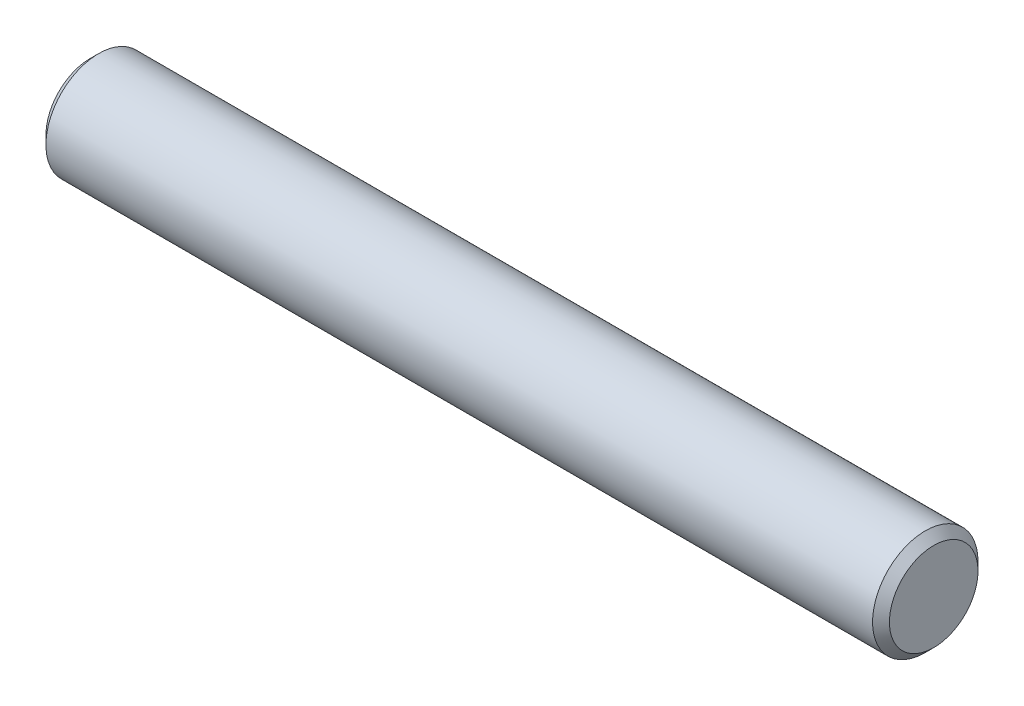
ISO-10303-21;
HEADER;
FILE_DESCRIPTION(('STEP AP214'),'2;1');
FILE_NAME('part.step','',(''),(''),'','','');
FILE_SCHEMA(('AUTOMOTIVE_DESIGN { 1 0 10303 214 1 1 1 1 }'));
ENDSEC;
DATA;
#1=APPLICATION_CONTEXT('core data for automotive mechanical design processes');
#2=APPLICATION_PROTOCOL_DEFINITION('international standard','automotive_design',2000,#1);
#3=PRODUCT_CONTEXT('',#1,'mechanical');
#4=PRODUCT('Part','Part','',(#3));
#5=PRODUCT_RELATED_PRODUCT_CATEGORY('part','',(#4));
#6=PRODUCT_DEFINITION_FORMATION('','',#4);
#7=PRODUCT_DEFINITION_CONTEXT('part definition',#1,'design');
#8=PRODUCT_DEFINITION('design','',#6,#7);
#9=PRODUCT_DEFINITION_SHAPE('','',#8);
#10=(LENGTH_UNIT() NAMED_UNIT(*) SI_UNIT(.MILLI.,.METRE.));
#11=(NAMED_UNIT(*) PLANE_ANGLE_UNIT() SI_UNIT($,.RADIAN.));
#12=(NAMED_UNIT(*) SI_UNIT($,.STERADIAN.) SOLID_ANGLE_UNIT());
#13=UNCERTAINTY_MEASURE_WITH_UNIT(LENGTH_MEASURE(1.E-05),#10,'distance_accuracy_value','');
#14=(GEOMETRIC_REPRESENTATION_CONTEXT(3) GLOBAL_UNCERTAINTY_ASSIGNED_CONTEXT((#13)) GLOBAL_UNIT_ASSIGNED_CONTEXT((#10,
#11,#12)) REPRESENTATION_CONTEXT('',''));
#15=CARTESIAN_POINT('',(0.,0.,0.));
#16=DIRECTION('',(0.,0.,1.));
#17=DIRECTION('',(1.,0.,0.));
#18=AXIS2_PLACEMENT_3D('',#15,#16,#17);
#19=CARTESIAN_POINT('',(100.,0.,0.));
#20=DIRECTION('',(1.,0.,0.));
#21=DIRECTION('',(0.,0.,-1.));
#22=AXIS2_PLACEMENT_3D('',#19,#20,#21);
#23=PLANE('',#22);
#24=CARTESIAN_POINT('',(100.,0.,0.));
#25=DIRECTION('',(1.,0.,0.));
#26=DIRECTION('',(0.,0.,-1.));
#27=AXIS2_PLACEMENT_3D('',#24,#25,#26);
#28=CIRCLE('',#27,10.5);
#29=CARTESIAN_POINT('',(100.,0.,-10.5));
#30=VERTEX_POINT('',#29);
#31=EDGE_CURVE('E53',#30,#30,#28,.T.);
#32=ORIENTED_EDGE('',*,*,#31,.T.);
#33=EDGE_LOOP('',(#32));
#34=FACE_BOUND('',#33,.T.);
#35=ADVANCED_FACE('F37',(#34),#23,.T.);
#36=CARTESIAN_POINT('',(-100.,0.,0.));
#37=DIRECTION('',(1.,0.,0.));
#38=DIRECTION('',(0.,0.,-1.));
#39=AXIS2_PLACEMENT_3D('',#36,#37,#38);
#40=PLANE('',#39);
#41=CARTESIAN_POINT('',(-100.,0.,0.));
#42=DIRECTION('',(1.,0.,0.));
#43=DIRECTION('',(0.,0.,-1.));
#44=AXIS2_PLACEMENT_3D('',#41,#42,#43);
#45=CIRCLE('',#44,10.5);
#46=CARTESIAN_POINT('',(-100.,0.,-10.5));
#47=VERTEX_POINT('',#46);
#48=EDGE_CURVE('E10',#47,#47,#45,.F.);
#49=ORIENTED_EDGE('',*,*,#48,.T.);
#50=EDGE_LOOP('',(#49));
#51=FACE_BOUND('',#50,.T.);
#52=ADVANCED_FACE('F69',(#51),#40,.F.);
#53=CARTESIAN_POINT('',(100.,0.,0.));
#54=DIRECTION('',(-1.,0.,0.));
#55=DIRECTION('',(0.,0.,1.));
#56=AXIS2_PLACEMENT_3D('',#53,#54,#55);
#57=CYLINDRICAL_SURFACE('',#56,12.5);
#58=CARTESIAN_POINT('',(98.,0.,0.));
#59=DIRECTION('',(1.,0.,0.));
#60=DIRECTION('',(0.,0.,-1.));
#61=AXIS2_PLACEMENT_3D('',#58,#59,#60);
#62=CIRCLE('',#61,12.5);
#63=CARTESIAN_POINT('',(98.,0.,-12.5));
#64=VERTEX_POINT('',#63);
#65=EDGE_CURVE('E45',#64,#64,#62,.F.);
#66=ORIENTED_EDGE('',*,*,#65,.T.);
#67=EDGE_LOOP('',(#66));
#68=FACE_BOUND('',#67,.T.);
#69=CARTESIAN_POINT('',(-98.,0.,0.));
#70=DIRECTION('',(1.,0.,0.));
#71=DIRECTION('',(0.,0.,-1.));
#72=AXIS2_PLACEMENT_3D('',#69,#70,#71);
#73=CIRCLE('',#72,12.5);
#74=CARTESIAN_POINT('',(-98.,0.,-12.5));
#75=VERTEX_POINT('',#74);
#76=EDGE_CURVE('E49',#75,#75,#73,.T.);
#77=ORIENTED_EDGE('',*,*,#76,.T.);
#78=EDGE_LOOP('',(#77));
#79=FACE_BOUND('',#78,.T.);
#80=ADVANCED_FACE('F62',(#68,#79),#57,.T.);
#81=CARTESIAN_POINT('',(100.,0.,0.));
#82=DIRECTION('',(-1.,0.,0.));
#83=DIRECTION('',(0.,0.,1.));
#84=AXIS2_PLACEMENT_3D('',#81,#82,#83);
#85=CONICAL_SURFACE('',#84,10.5,0.785398163397446);
#86=ORIENTED_EDGE('',*,*,#65,.F.);
#87=EDGE_LOOP('',(#86));
#88=FACE_BOUND('',#87,.T.);
#89=ORIENTED_EDGE('',*,*,#31,.F.);
#90=EDGE_LOOP('',(#89));
#91=FACE_BOUND('',#90,.T.);
#92=ADVANCED_FACE('F60',(#88,#91),#85,.T.);
#93=CARTESIAN_POINT('',(-98.,0.,0.));
#94=DIRECTION('',(1.,0.,0.));
#95=DIRECTION('',(0.,0.,-1.));
#96=AXIS2_PLACEMENT_3D('',#93,#94,#95);
#97=CONICAL_SURFACE('',#96,12.5,0.78539816339746);
#98=ORIENTED_EDGE('',*,*,#48,.F.);
#99=EDGE_LOOP('',(#98));
#100=FACE_BOUND('',#99,.T.);
#101=ORIENTED_EDGE('',*,*,#76,.F.);
#102=EDGE_LOOP('',(#101));
#103=FACE_BOUND('',#102,.T.);
#104=ADVANCED_FACE('F40',(#100,#103),#97,.T.);
#105=CLOSED_SHELL('',(#35,#52,#80,#92,#104));
#106=MANIFOLD_SOLID_BREP('B2',#105);
#107=ADVANCED_BREP_SHAPE_REPRESENTATION('',(#18,#106),#14);
#108=SHAPE_DEFINITION_REPRESENTATION(#9,#107);
ENDSEC;
END-ISO-10303-21;
